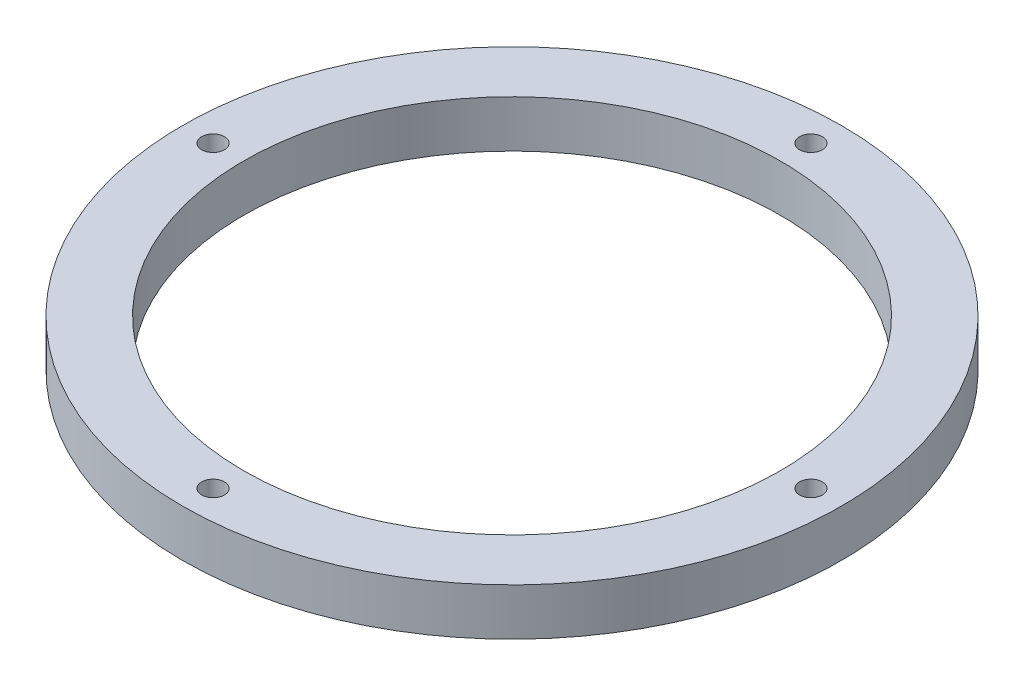
ISO-10303-21;
HEADER;
FILE_DESCRIPTION(('STEP AP214'),'2;1');
FILE_NAME('part.step','',(''),(''),'','','');
FILE_SCHEMA(('AUTOMOTIVE_DESIGN { 1 0 10303 214 1 1 1 1 }'));
ENDSEC;
DATA;
#1=APPLICATION_CONTEXT('core data for automotive mechanical design processes');
#2=APPLICATION_PROTOCOL_DEFINITION('international standard','automotive_design',2000,#1);
#3=PRODUCT_CONTEXT('',#1,'mechanical');
#4=PRODUCT('Part','Part','',(#3));
#5=PRODUCT_RELATED_PRODUCT_CATEGORY('part','',(#4));
#6=PRODUCT_DEFINITION_FORMATION('','',#4);
#7=PRODUCT_DEFINITION_CONTEXT('part definition',#1,'design');
#8=PRODUCT_DEFINITION('design','',#6,#7);
#9=PRODUCT_DEFINITION_SHAPE('','',#8);
#10=(LENGTH_UNIT() NAMED_UNIT(*) SI_UNIT(.MILLI.,.METRE.));
#11=(NAMED_UNIT(*) PLANE_ANGLE_UNIT() SI_UNIT($,.RADIAN.));
#12=(NAMED_UNIT(*) SI_UNIT($,.STERADIAN.) SOLID_ANGLE_UNIT());
#13=UNCERTAINTY_MEASURE_WITH_UNIT(LENGTH_MEASURE(1.E-05),#10,'distance_accuracy_value','');
#14=(GEOMETRIC_REPRESENTATION_CONTEXT(3) GLOBAL_UNCERTAINTY_ASSIGNED_CONTEXT((#13)) GLOBAL_UNIT_ASSIGNED_CONTEXT((#10,
#11,#12)) REPRESENTATION_CONTEXT('',''));
#15=CARTESIAN_POINT('',(0.,0.,0.));
#16=DIRECTION('',(0.,0.,1.));
#17=DIRECTION('',(1.,0.,0.));
#18=AXIS2_PLACEMENT_3D('',#15,#16,#17);
#19=CARTESIAN_POINT('',(0.,10.,0.));
#20=DIRECTION('',(0.,-1.,0.));
#21=DIRECTION('',(0.,0.,-1.));
#22=AXIS2_PLACEMENT_3D('',#19,#20,#21);
#23=CYLINDRICAL_SURFACE('',#22,70.);
#24=CARTESIAN_POINT('',(0.,10.,0.));
#25=DIRECTION('',(0.,1.,0.));
#26=DIRECTION('',(0.,0.,1.));
#27=AXIS2_PLACEMENT_3D('',#24,#25,#26);
#28=CIRCLE('',#27,70.);
#29=CARTESIAN_POINT('',(0.,10.,70.));
#30=VERTEX_POINT('',#29);
#31=EDGE_CURVE('E10',#30,#30,#28,.T.);
#32=ORIENTED_EDGE('',*,*,#31,.F.);
#33=EDGE_LOOP('',(#32));
#34=FACE_BOUND('',#33,.T.);
#35=CARTESIAN_POINT('',(0.,0.,0.));
#36=DIRECTION('',(0.,1.,0.));
#37=DIRECTION('',(0.,0.,1.));
#38=AXIS2_PLACEMENT_3D('',#35,#36,#37);
#39=CIRCLE('',#38,70.);
#40=CARTESIAN_POINT('',(0.,0.,70.));
#41=VERTEX_POINT('',#40);
#42=EDGE_CURVE('E46',#41,#41,#39,.T.);
#43=ORIENTED_EDGE('',*,*,#42,.T.);
#44=EDGE_LOOP('',(#43));
#45=FACE_BOUND('',#44,.T.);
#46=ADVANCED_FACE('F43',(#34,#45),#23,.T.);
#47=CARTESIAN_POINT('',(0.,10.,0.));
#48=DIRECTION('',(0.,1.,0.));
#49=DIRECTION('',(0.,0.,1.));
#50=AXIS2_PLACEMENT_3D('',#47,#48,#49);
#51=PLANE('',#50);
#52=CARTESIAN_POINT('',(-63.5,10.,0.));
#53=DIRECTION('',(0.,1.,0.));
#54=DIRECTION('',(0.,0.,1.));
#55=AXIS2_PLACEMENT_3D('',#52,#53,#54);
#56=CIRCLE('',#55,2.42150546672418);
#57=CARTESIAN_POINT('',(-63.5,10.,2.42150546672418));
#58=VERTEX_POINT('',#57);
#59=EDGE_CURVE('E89',#58,#58,#56,.T.);
#60=ORIENTED_EDGE('',*,*,#59,.F.);
#61=EDGE_LOOP('',(#60));
#62=FACE_BOUND('',#61,.T.);
#63=CARTESIAN_POINT('',(2.21709065016539E-13,10.,-63.5));
#64=DIRECTION('',(0.,1.,0.));
#65=DIRECTION('',(0.,0.,1.));
#66=AXIS2_PLACEMENT_3D('',#63,#64,#65);
#67=CIRCLE('',#66,2.42150546672417);
#68=CARTESIAN_POINT('',(2.21709065016539E-13,10.,-61.0784945332758));
#69=VERTEX_POINT('',#68);
#70=EDGE_CURVE('E85',#69,#69,#67,.T.);
#71=ORIENTED_EDGE('',*,*,#70,.F.);
#72=EDGE_LOOP('',(#71));
#73=FACE_BOUND('',#72,.T.);
#74=CARTESIAN_POINT('',(63.5,10.,4.43418130033078E-13));
#75=DIRECTION('',(0.,1.,0.));
#76=DIRECTION('',(0.,0.,1.));
#77=AXIS2_PLACEMENT_3D('',#74,#75,#76);
#78=CIRCLE('',#77,2.42150546672418);
#79=CARTESIAN_POINT('',(63.5,10.,2.42150546672462));
#80=VERTEX_POINT('',#79);
#81=EDGE_CURVE('E77',#80,#80,#78,.T.);
#82=ORIENTED_EDGE('',*,*,#81,.F.);
#83=EDGE_LOOP('',(#82));
#84=FACE_BOUND('',#83,.T.);
#85=CARTESIAN_POINT('',(-6.65127195049617E-13,10.,63.5));
#86=DIRECTION('',(0.,1.,0.));
#87=DIRECTION('',(0.,0.,1.));
#88=AXIS2_PLACEMENT_3D('',#85,#86,#87);
#89=CIRCLE('',#88,2.42150546672418);
#90=CARTESIAN_POINT('',(-6.65127195049617E-13,10.,65.9215054667242));
#91=VERTEX_POINT('',#90);
#92=EDGE_CURVE('E69',#91,#91,#89,.T.);
#93=ORIENTED_EDGE('',*,*,#92,.F.);
#94=EDGE_LOOP('',(#93));
#95=FACE_BOUND('',#94,.T.);
#96=CARTESIAN_POINT('',(0.,10.,0.));
#97=DIRECTION('',(0.,1.,0.));
#98=DIRECTION('',(0.,0.,1.));
#99=AXIS2_PLACEMENT_3D('',#96,#97,#98);
#100=CIRCLE('',#99,57.);
#101=CARTESIAN_POINT('',(0.,10.,57.));
#102=VERTEX_POINT('',#101);
#103=EDGE_CURVE('E57',#102,#102,#100,.T.);
#104=ORIENTED_EDGE('',*,*,#103,.F.);
#105=EDGE_LOOP('',(#104));
#106=FACE_BOUND('',#105,.T.);
#107=ORIENTED_EDGE('',*,*,#31,.T.);
#108=EDGE_LOOP('',(#107));
#109=FACE_BOUND('',#108,.T.);
#110=ADVANCED_FACE('F107',(#62,#73,#84,#95,#106,#109),#51,.T.);
#111=CARTESIAN_POINT('',(0.,0.,0.));
#112=DIRECTION('',(0.,1.,0.));
#113=DIRECTION('',(0.,0.,1.));
#114=AXIS2_PLACEMENT_3D('',#111,#112,#113);
#115=PLANE('',#114);
#116=CARTESIAN_POINT('',(-63.5,0.,0.));
#117=DIRECTION('',(0.,1.,0.));
#118=DIRECTION('',(0.,0.,1.));
#119=AXIS2_PLACEMENT_3D('',#116,#117,#118);
#120=CIRCLE('',#119,2.42150546672418);
#121=CARTESIAN_POINT('',(-63.5,0.,2.42150546672418));
#122=VERTEX_POINT('',#121);
#123=EDGE_CURVE('E61',#122,#122,#120,.T.);
#124=ORIENTED_EDGE('',*,*,#123,.T.);
#125=EDGE_LOOP('',(#124));
#126=FACE_BOUND('',#125,.T.);
#127=CARTESIAN_POINT('',(2.21709065016539E-13,0.,-63.5));
#128=DIRECTION('',(0.,1.,0.));
#129=DIRECTION('',(0.,0.,1.));
#130=AXIS2_PLACEMENT_3D('',#127,#128,#129);
#131=CIRCLE('',#130,2.42150546672417);
#132=CARTESIAN_POINT('',(2.21709065016539E-13,0.,-61.0784945332758));
#133=VERTEX_POINT('',#132);
#134=EDGE_CURVE('E81',#133,#133,#131,.T.);
#135=ORIENTED_EDGE('',*,*,#134,.T.);
#136=EDGE_LOOP('',(#135));
#137=FACE_BOUND('',#136,.T.);
#138=CARTESIAN_POINT('',(63.5,0.,4.43418130033078E-13));
#139=DIRECTION('',(0.,1.,0.));
#140=DIRECTION('',(0.,0.,1.));
#141=AXIS2_PLACEMENT_3D('',#138,#139,#140);
#142=CIRCLE('',#141,2.42150546672418);
#143=CARTESIAN_POINT('',(63.5,0.,2.42150546672462));
#144=VERTEX_POINT('',#143);
#145=EDGE_CURVE('E73',#144,#144,#142,.T.);
#146=ORIENTED_EDGE('',*,*,#145,.T.);
#147=EDGE_LOOP('',(#146));
#148=FACE_BOUND('',#147,.T.);
#149=CARTESIAN_POINT('',(-6.65127195049617E-13,0.,63.5));
#150=DIRECTION('',(0.,1.,0.));
#151=DIRECTION('',(0.,0.,1.));
#152=AXIS2_PLACEMENT_3D('',#149,#150,#151);
#153=CIRCLE('',#152,2.42150546672418);
#154=CARTESIAN_POINT('',(-6.65127195049617E-13,0.,65.9215054667242));
#155=VERTEX_POINT('',#154);
#156=EDGE_CURVE('E65',#155,#155,#153,.T.);
#157=ORIENTED_EDGE('',*,*,#156,.T.);
#158=EDGE_LOOP('',(#157));
#159=FACE_BOUND('',#158,.T.);
#160=CARTESIAN_POINT('',(0.,0.,0.));
#161=DIRECTION('',(0.,1.,0.));
#162=DIRECTION('',(0.,0.,1.));
#163=AXIS2_PLACEMENT_3D('',#160,#161,#162);
#164=CIRCLE('',#163,57.);
#165=CARTESIAN_POINT('',(0.,0.,57.));
#166=VERTEX_POINT('',#165);
#167=EDGE_CURVE('E55',#166,#166,#164,.T.);
#168=ORIENTED_EDGE('',*,*,#167,.T.);
#169=EDGE_LOOP('',(#168));
#170=FACE_BOUND('',#169,.T.);
#171=ORIENTED_EDGE('',*,*,#42,.F.);
#172=EDGE_LOOP('',(#171));
#173=FACE_BOUND('',#172,.T.);
#174=ADVANCED_FACE('F97',(#126,#137,#148,#159,#170,#173),#115,.F.);
#175=CARTESIAN_POINT('',(0.,0.,0.));
#176=DIRECTION('',(0.,1.,0.));
#177=DIRECTION('',(0.,0.,1.));
#178=AXIS2_PLACEMENT_3D('',#175,#176,#177);
#179=CYLINDRICAL_SURFACE('',#178,57.);
#180=ORIENTED_EDGE('',*,*,#167,.F.);
#181=EDGE_LOOP('',(#180));
#182=FACE_BOUND('',#181,.T.);
#183=ORIENTED_EDGE('',*,*,#103,.T.);
#184=EDGE_LOOP('',(#183));
#185=FACE_BOUND('',#184,.T.);
#186=ADVANCED_FACE('F119',(#182,#185),#179,.F.);
#187=CARTESIAN_POINT('',(-6.65127195049617E-13,0.,63.5));
#188=DIRECTION('',(0.,1.,0.));
#189=DIRECTION('',(0.,0.,1.));
#190=AXIS2_PLACEMENT_3D('',#187,#188,#189);
#191=CYLINDRICAL_SURFACE('',#190,2.42150546672418);
#192=ORIENTED_EDGE('',*,*,#156,.F.);
#193=EDGE_LOOP('',(#192));
#194=FACE_BOUND('',#193,.T.);
#195=ORIENTED_EDGE('',*,*,#92,.T.);
#196=EDGE_LOOP('',(#195));
#197=FACE_BOUND('',#196,.T.);
#198=ADVANCED_FACE('F121',(#194,#197),#191,.F.);
#199=CARTESIAN_POINT('',(63.5,0.,4.43418130033078E-13));
#200=DIRECTION('',(0.,1.,0.));
#201=DIRECTION('',(0.,0.,1.));
#202=AXIS2_PLACEMENT_3D('',#199,#200,#201);
#203=CYLINDRICAL_SURFACE('',#202,2.42150546672418);
#204=ORIENTED_EDGE('',*,*,#145,.F.);
#205=EDGE_LOOP('',(#204));
#206=FACE_BOUND('',#205,.T.);
#207=ORIENTED_EDGE('',*,*,#81,.T.);
#208=EDGE_LOOP('',(#207));
#209=FACE_BOUND('',#208,.T.);
#210=ADVANCED_FACE('F128',(#206,#209),#203,.F.);
#211=CARTESIAN_POINT('',(2.21709065016539E-13,0.,-63.5));
#212=DIRECTION('',(0.,1.,0.));
#213=DIRECTION('',(0.,0.,1.));
#214=AXIS2_PLACEMENT_3D('',#211,#212,#213);
#215=CYLINDRICAL_SURFACE('',#214,2.42150546672417);
#216=ORIENTED_EDGE('',*,*,#134,.F.);
#217=EDGE_LOOP('',(#216));
#218=FACE_BOUND('',#217,.T.);
#219=ORIENTED_EDGE('',*,*,#70,.T.);
#220=EDGE_LOOP('',(#219));
#221=FACE_BOUND('',#220,.T.);
#222=ADVANCED_FACE('F103',(#218,#221),#215,.F.);
#223=CARTESIAN_POINT('',(-63.5,0.,0.));
#224=DIRECTION('',(0.,1.,0.));
#225=DIRECTION('',(0.,0.,1.));
#226=AXIS2_PLACEMENT_3D('',#223,#224,#225);
#227=CYLINDRICAL_SURFACE('',#226,2.42150546672418);
#228=ORIENTED_EDGE('',*,*,#123,.F.);
#229=EDGE_LOOP('',(#228));
#230=FACE_BOUND('',#229,.T.);
#231=ORIENTED_EDGE('',*,*,#59,.T.);
#232=EDGE_LOOP('',(#231));
#233=FACE_BOUND('',#232,.T.);
#234=ADVANCED_FACE('F100',(#230,#233),#227,.F.);
#235=CLOSED_SHELL('',(#46,#110,#174,#186,#198,#210,#222,#234));
#236=MANIFOLD_SOLID_BREP('B2',#235);
#237=ADVANCED_BREP_SHAPE_REPRESENTATION('',(#18,#236),#14);
#238=SHAPE_DEFINITION_REPRESENTATION(#9,#237);
ENDSEC;
END-ISO-10303-21;
